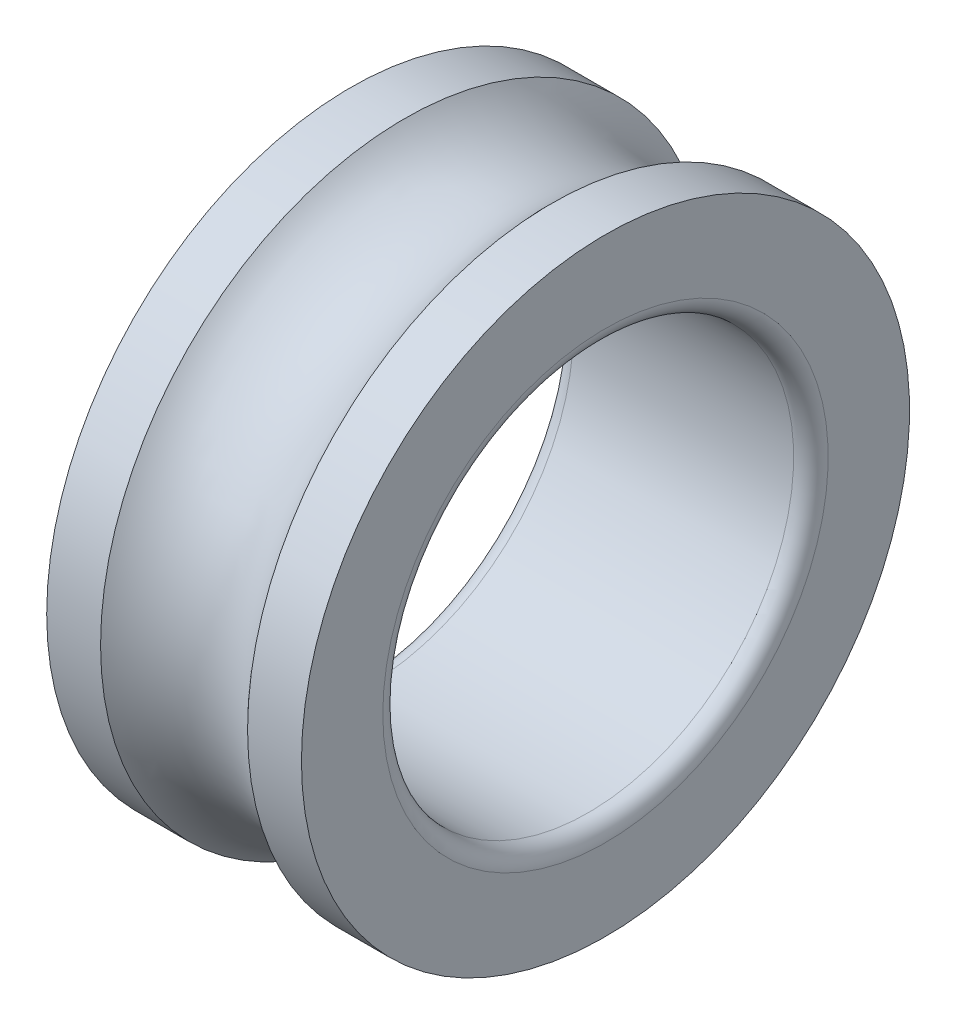
ISO-10303-21;
HEADER;
FILE_DESCRIPTION(('STEP AP214'),'2;1');
FILE_NAME('part.step','',(''),(''),'','','');
FILE_SCHEMA(('AUTOMOTIVE_DESIGN { 1 0 10303 214 1 1 1 1 }'));
ENDSEC;
DATA;
#1=APPLICATION_CONTEXT('core data for automotive mechanical design processes');
#2=APPLICATION_PROTOCOL_DEFINITION('international standard','automotive_design',2000,#1);
#3=PRODUCT_CONTEXT('',#1,'mechanical');
#4=PRODUCT('Part','Part','',(#3));
#5=PRODUCT_RELATED_PRODUCT_CATEGORY('part','',(#4));
#6=PRODUCT_DEFINITION_FORMATION('','',#4);
#7=PRODUCT_DEFINITION_CONTEXT('part definition',#1,'design');
#8=PRODUCT_DEFINITION('design','',#6,#7);
#9=PRODUCT_DEFINITION_SHAPE('','',#8);
#10=(LENGTH_UNIT() NAMED_UNIT(*) SI_UNIT(.MILLI.,.METRE.));
#11=(NAMED_UNIT(*) PLANE_ANGLE_UNIT() SI_UNIT($,.RADIAN.));
#12=(NAMED_UNIT(*) SI_UNIT($,.STERADIAN.) SOLID_ANGLE_UNIT());
#13=UNCERTAINTY_MEASURE_WITH_UNIT(LENGTH_MEASURE(1.E-05),#10,'distance_accuracy_value','');
#14=(GEOMETRIC_REPRESENTATION_CONTEXT(3) GLOBAL_UNCERTAINTY_ASSIGNED_CONTEXT((#13)) GLOBAL_UNIT_ASSIGNED_CONTEXT((#10,
#11,#12)) REPRESENTATION_CONTEXT('',''));
#15=CARTESIAN_POINT('',(0.,0.,0.));
#16=DIRECTION('',(0.,0.,1.));
#17=DIRECTION('',(1.,0.,0.));
#18=AXIS2_PLACEMENT_3D('',#15,#16,#17);
#19=CARTESIAN_POINT('',(15.5,37.,0.));
#20=DIRECTION('',(-1.,0.,0.));
#21=DIRECTION('',(0.,0.,1.));
#22=AXIS2_PLACEMENT_3D('',#19,#20,#21);
#23=PLANE('',#22);
#24=CARTESIAN_POINT('',(15.5,0.,0.));
#25=DIRECTION('',(-1.,0.,0.));
#26=DIRECTION('',(0.,0.,1.));
#27=AXIS2_PLACEMENT_3D('',#24,#25,#26);
#28=CIRCLE('',#27,27.1);
#29=CARTESIAN_POINT('',(15.5,0.,27.1));
#30=VERTEX_POINT('',#29);
#31=EDGE_CURVE('E10',#30,#30,#28,.T.);
#32=ORIENTED_EDGE('',*,*,#31,.T.);
#33=EDGE_LOOP('',(#32));
#34=FACE_BOUND('',#33,.T.);
#35=CARTESIAN_POINT('',(15.5,0.,0.));
#36=DIRECTION('',(-1.,0.,0.));
#37=DIRECTION('',(0.,0.,1.));
#38=AXIS2_PLACEMENT_3D('',#35,#36,#37);
#39=CIRCLE('',#38,37.);
#40=CARTESIAN_POINT('',(15.5,0.,37.));
#41=VERTEX_POINT('',#40);
#42=EDGE_CURVE('E54',#41,#41,#39,.T.);
#43=ORIENTED_EDGE('',*,*,#42,.F.);
#44=EDGE_LOOP('',(#43));
#45=FACE_BOUND('',#44,.T.);
#46=ADVANCED_FACE('F34',(#34,#45),#23,.F.);
#47=CARTESIAN_POINT('',(0.,0.,0.));
#48=DIRECTION('',(-1.,0.,0.));
#49=DIRECTION('',(0.,0.,1.));
#50=AXIS2_PLACEMENT_3D('',#47,#48,#49);
#51=CYLINDRICAL_SURFACE('',#50,37.);
#52=CARTESIAN_POINT('',(8.94427190999915,0.,0.));
#53=DIRECTION('',(-1.,0.,0.));
#54=DIRECTION('',(0.,0.,1.));
#55=AXIS2_PLACEMENT_3D('',#52,#53,#54);
#56=CIRCLE('',#55,37.);
#57=CARTESIAN_POINT('',(8.94427190999915,0.,37.));
#58=VERTEX_POINT('',#57);
#59=EDGE_CURVE('E57',#58,#58,#56,.T.);
#60=ORIENTED_EDGE('',*,*,#59,.F.);
#61=EDGE_LOOP('',(#60));
#62=FACE_BOUND('',#61,.T.);
#63=ORIENTED_EDGE('',*,*,#42,.T.);
#64=EDGE_LOOP('',(#63));
#65=FACE_BOUND('',#64,.T.);
#66=ADVANCED_FACE('F78',(#62,#65),#51,.T.);
#67=CARTESIAN_POINT('',(0.,0.,0.));
#68=DIRECTION('',(-1.,0.,0.));
#69=DIRECTION('',(0.,0.,1.));
#70=AXIS2_PLACEMENT_3D('',#67,#68,#69);
#71=TOROIDAL_SURFACE('',#70,45.,12.);
#72=CARTESIAN_POINT('',(-8.94427190999916,0.,0.));
#73=DIRECTION('',(-1.,0.,0.));
#74=DIRECTION('',(0.,0.,1.));
#75=AXIS2_PLACEMENT_3D('',#72,#73,#74);
#76=CIRCLE('',#75,37.);
#77=CARTESIAN_POINT('',(-8.94427190999916,0.,37.));
#78=VERTEX_POINT('',#77);
#79=EDGE_CURVE('E60',#78,#78,#76,.T.);
#80=ORIENTED_EDGE('',*,*,#79,.F.);
#81=EDGE_LOOP('',(#80));
#82=FACE_BOUND('',#81,.T.);
#83=ORIENTED_EDGE('',*,*,#59,.T.);
#84=EDGE_LOOP('',(#83));
#85=FACE_BOUND('',#84,.T.);
#86=ADVANCED_FACE('F72',(#82,#85),#71,.F.);
#87=CARTESIAN_POINT('',(0.,0.,0.));
#88=DIRECTION('',(-1.,0.,0.));
#89=DIRECTION('',(0.,0.,1.));
#90=AXIS2_PLACEMENT_3D('',#87,#88,#89);
#91=CYLINDRICAL_SURFACE('',#90,37.);
#92=CARTESIAN_POINT('',(-15.5,0.,0.));
#93=DIRECTION('',(-1.,0.,0.));
#94=DIRECTION('',(0.,0.,1.));
#95=AXIS2_PLACEMENT_3D('',#92,#93,#94);
#96=CIRCLE('',#95,37.);
#97=CARTESIAN_POINT('',(-15.5,0.,37.));
#98=VERTEX_POINT('',#97);
#99=EDGE_CURVE('E63',#98,#98,#96,.T.);
#100=ORIENTED_EDGE('',*,*,#99,.F.);
#101=EDGE_LOOP('',(#100));
#102=FACE_BOUND('',#101,.T.);
#103=ORIENTED_EDGE('',*,*,#79,.T.);
#104=EDGE_LOOP('',(#103));
#105=FACE_BOUND('',#104,.T.);
#106=ADVANCED_FACE('F69',(#102,#105),#91,.T.);
#107=CARTESIAN_POINT('',(-15.5,37.,0.));
#108=DIRECTION('',(1.,0.,0.));
#109=DIRECTION('',(0.,0.,-1.));
#110=AXIS2_PLACEMENT_3D('',#107,#108,#109);
#111=PLANE('',#110);
#112=CARTESIAN_POINT('',(-15.5,0.,0.));
#113=DIRECTION('',(1.,0.,0.));
#114=DIRECTION('',(0.,0.,-1.));
#115=AXIS2_PLACEMENT_3D('',#112,#113,#114);
#116=CIRCLE('',#115,27.1);
#117=CARTESIAN_POINT('',(-15.5,0.,-27.1));
#118=VERTEX_POINT('',#117);
#119=EDGE_CURVE('E41',#118,#118,#116,.T.);
#120=ORIENTED_EDGE('',*,*,#119,.T.);
#121=EDGE_LOOP('',(#120));
#122=FACE_BOUND('',#121,.T.);
#123=ORIENTED_EDGE('',*,*,#99,.T.);
#124=EDGE_LOOP('',(#123));
#125=FACE_BOUND('',#124,.T.);
#126=ADVANCED_FACE('F67',(#122,#125),#111,.F.);
#127=CARTESIAN_POINT('',(0.,0.,0.));
#128=DIRECTION('',(-1.,0.,0.));
#129=DIRECTION('',(0.,0.,1.));
#130=AXIS2_PLACEMENT_3D('',#127,#128,#129);
#131=CYLINDRICAL_SURFACE('',#130,25.);
#132=CARTESIAN_POINT('',(-13.4,0.,0.));
#133=DIRECTION('',(1.,0.,0.));
#134=DIRECTION('',(0.,0.,-1.));
#135=AXIS2_PLACEMENT_3D('',#132,#133,#134);
#136=CIRCLE('',#135,25.);
#137=CARTESIAN_POINT('',(-13.4,0.,-25.));
#138=VERTEX_POINT('',#137);
#139=EDGE_CURVE('E45',#138,#138,#136,.F.);
#140=ORIENTED_EDGE('',*,*,#139,.T.);
#141=EDGE_LOOP('',(#140));
#142=FACE_BOUND('',#141,.T.);
#143=CARTESIAN_POINT('',(13.4,0.,0.));
#144=DIRECTION('',(-1.,0.,0.));
#145=DIRECTION('',(0.,0.,1.));
#146=AXIS2_PLACEMENT_3D('',#143,#144,#145);
#147=CIRCLE('',#146,25.);
#148=CARTESIAN_POINT('',(13.4,0.,25.));
#149=VERTEX_POINT('',#148);
#150=EDGE_CURVE('E49',#149,#149,#147,.F.);
#151=ORIENTED_EDGE('',*,*,#150,.T.);
#152=EDGE_LOOP('',(#151));
#153=FACE_BOUND('',#152,.T.);
#154=ADVANCED_FACE('F93',(#142,#153),#131,.F.);
#155=CARTESIAN_POINT('',(-13.4,0.,0.));
#156=DIRECTION('',(1.,0.,0.));
#157=DIRECTION('',(0.,0.,-1.));
#158=AXIS2_PLACEMENT_3D('',#155,#156,#157);
#159=TOROIDAL_SURFACE('',#158,27.1,2.1);
#160=ORIENTED_EDGE('',*,*,#119,.F.);
#161=EDGE_LOOP('',(#160));
#162=FACE_BOUND('',#161,.T.);
#163=ORIENTED_EDGE('',*,*,#139,.F.);
#164=EDGE_LOOP('',(#163));
#165=FACE_BOUND('',#164,.T.);
#166=ADVANCED_FACE('F91',(#162,#165),#159,.T.);
#167=CARTESIAN_POINT('',(13.4,0.,0.));
#168=DIRECTION('',(-1.,0.,0.));
#169=DIRECTION('',(0.,0.,1.));
#170=AXIS2_PLACEMENT_3D('',#167,#168,#169);
#171=TOROIDAL_SURFACE('',#170,27.1,2.1);
#172=ORIENTED_EDGE('',*,*,#150,.F.);
#173=EDGE_LOOP('',(#172));
#174=FACE_BOUND('',#173,.T.);
#175=ORIENTED_EDGE('',*,*,#31,.F.);
#176=EDGE_LOOP('',(#175));
#177=FACE_BOUND('',#176,.T.);
#178=ADVANCED_FACE('F36',(#174,#177),#171,.T.);
#179=CLOSED_SHELL('',(#46,#66,#86,#106,#126,#154,#166,#178));
#180=MANIFOLD_SOLID_BREP('B2',#179);
#181=ADVANCED_BREP_SHAPE_REPRESENTATION('',(#18,#180),#14);
#182=SHAPE_DEFINITION_REPRESENTATION(#9,#181);
ENDSEC;
END-ISO-10303-21;
